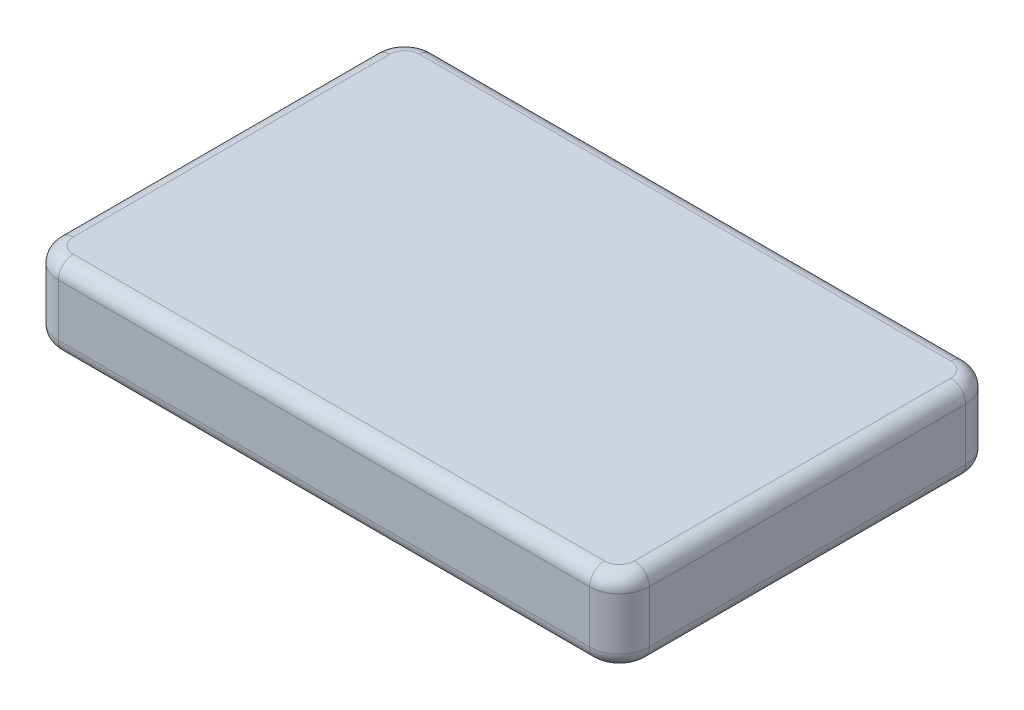
ISO-10303-21;
HEADER;
FILE_DESCRIPTION(('STEP AP214'),'2;1');
FILE_NAME('part.step','',(''),(''),'','','');
FILE_SCHEMA(('AUTOMOTIVE_DESIGN { 1 0 10303 214 1 1 1 1 }'));
ENDSEC;
DATA;
#1=APPLICATION_CONTEXT('core data for automotive mechanical design processes');
#2=APPLICATION_PROTOCOL_DEFINITION('international standard','automotive_design',2000,#1);
#3=PRODUCT_CONTEXT('',#1,'mechanical');
#4=PRODUCT('Part','Part','',(#3));
#5=PRODUCT_RELATED_PRODUCT_CATEGORY('part','',(#4));
#6=PRODUCT_DEFINITION_FORMATION('','',#4);
#7=PRODUCT_DEFINITION_CONTEXT('part definition',#1,'design');
#8=PRODUCT_DEFINITION('design','',#6,#7);
#9=PRODUCT_DEFINITION_SHAPE('','',#8);
#10=(LENGTH_UNIT() NAMED_UNIT(*) SI_UNIT(.MILLI.,.METRE.));
#11=(NAMED_UNIT(*) PLANE_ANGLE_UNIT() SI_UNIT($,.RADIAN.));
#12=(NAMED_UNIT(*) SI_UNIT($,.STERADIAN.) SOLID_ANGLE_UNIT());
#13=UNCERTAINTY_MEASURE_WITH_UNIT(LENGTH_MEASURE(1.E-05),#10,'distance_accuracy_value','');
#14=(GEOMETRIC_REPRESENTATION_CONTEXT(3) GLOBAL_UNCERTAINTY_ASSIGNED_CONTEXT((#13)) GLOBAL_UNIT_ASSIGNED_CONTEXT((#10,
#11,#12)) REPRESENTATION_CONTEXT('',''));
#15=CARTESIAN_POINT('',(0.,0.,0.));
#16=DIRECTION('',(0.,0.,1.));
#17=DIRECTION('',(1.,0.,0.));
#18=AXIS2_PLACEMENT_3D('',#15,#16,#17);
#19=CARTESIAN_POINT('',(-19.8,5.5,12.6));
#20=DIRECTION('',(1.,0.,0.));
#21=DIRECTION('',(0.,0.,-1.));
#22=AXIS2_PLACEMENT_3D('',#19,#20,#21);
#23=PLANE('',#22);
#24=DIRECTION('',(0.,-1.,0.));
#25=VECTOR('',#24,1.);
#26=CARTESIAN_POINT('',(-19.8,5.5,-10.6));
#27=LINE('',#26,#25);
#28=CARTESIAN_POINT('',(-19.8,4.5,-10.6));
#29=VERTEX_POINT('',#28);
#30=CARTESIAN_POINT('',(-19.8,1.,-10.6));
#31=VERTEX_POINT('',#30);
#32=EDGE_CURVE('E200',#29,#31,#27,.T.);
#33=ORIENTED_EDGE('',*,*,#32,.T.);
#34=DIRECTION('',(0.,0.,1.));
#35=VECTOR('',#34,1.);
#36=CARTESIAN_POINT('',(-19.8,1.,12.6));
#37=LINE('',#36,#35);
#38=CARTESIAN_POINT('',(-19.8,1.,10.6));
#39=VERTEX_POINT('',#38);
#40=EDGE_CURVE('E228',#31,#39,#37,.T.);
#41=ORIENTED_EDGE('',*,*,#40,.T.);
#42=DIRECTION('',(0.,-1.,0.));
#43=VECTOR('',#42,1.);
#44=CARTESIAN_POINT('',(-19.8,5.5,10.6));
#45=LINE('',#44,#43);
#46=CARTESIAN_POINT('',(-19.8,4.5,10.6));
#47=VERTEX_POINT('',#46);
#48=EDGE_CURVE('E194',#39,#47,#45,.F.);
#49=ORIENTED_EDGE('',*,*,#48,.T.);
#50=DIRECTION('',(0.,0.,1.));
#51=VECTOR('',#50,1.);
#52=CARTESIAN_POINT('',(-19.8,4.5,-10.6));
#53=LINE('',#52,#51);
#54=EDGE_CURVE('E225',#47,#29,#53,.F.);
#55=ORIENTED_EDGE('',*,*,#54,.T.);
#56=EDGE_LOOP('',(#33,#41,#49,#55));
#57=FACE_BOUND('',#56,.T.);
#58=ADVANCED_FACE('F38',(#57),#23,.F.);
#59=CARTESIAN_POINT('',(19.8,5.5,12.6));
#60=DIRECTION('',(0.,0.,-1.));
#61=DIRECTION('',(-1.,0.,0.));
#62=AXIS2_PLACEMENT_3D('',#59,#60,#61);
#63=PLANE('',#62);
#64=DIRECTION('',(0.,-1.,0.));
#65=VECTOR('',#64,1.);
#66=CARTESIAN_POINT('',(-17.8,5.5,12.6));
#67=LINE('',#66,#65);
#68=CARTESIAN_POINT('',(-17.8,4.5,12.6));
#69=VERTEX_POINT('',#68);
#70=CARTESIAN_POINT('',(-17.8,1.,12.6));
#71=VERTEX_POINT('',#70);
#72=EDGE_CURVE('E181',#69,#71,#67,.T.);
#73=ORIENTED_EDGE('',*,*,#72,.T.);
#74=DIRECTION('',(1.,0.,0.));
#75=VECTOR('',#74,1.);
#76=CARTESIAN_POINT('',(19.8,1.,12.6));
#77=LINE('',#76,#75);
#78=CARTESIAN_POINT('',(17.8,1.,12.6));
#79=VERTEX_POINT('',#78);
#80=EDGE_CURVE('E155',#71,#79,#77,.T.);
#81=ORIENTED_EDGE('',*,*,#80,.T.);
#82=DIRECTION('',(0.,-1.,0.));
#83=VECTOR('',#82,1.);
#84=CARTESIAN_POINT('',(17.8,5.5,12.6));
#85=LINE('',#84,#83);
#86=CARTESIAN_POINT('',(17.8,4.5,12.6));
#87=VERTEX_POINT('',#86);
#88=EDGE_CURVE('E178',#79,#87,#85,.F.);
#89=ORIENTED_EDGE('',*,*,#88,.T.);
#90=DIRECTION('',(1.,0.,0.));
#91=VECTOR('',#90,1.);
#92=CARTESIAN_POINT('',(-17.8,4.5,12.6));
#93=LINE('',#92,#91);
#94=EDGE_CURVE('E184',#87,#69,#93,.F.);
#95=ORIENTED_EDGE('',*,*,#94,.T.);
#96=EDGE_LOOP('',(#73,#81,#89,#95));
#97=FACE_BOUND('',#96,.T.);
#98=ADVANCED_FACE('F177',(#97),#63,.F.);
#99=CARTESIAN_POINT('',(19.8,5.5,12.6));
#100=DIRECTION('',(-1.,0.,0.));
#101=DIRECTION('',(0.,0.,1.));
#102=AXIS2_PLACEMENT_3D('',#99,#100,#101);
#103=PLANE('',#102);
#104=DIRECTION('',(0.,-1.,0.));
#105=VECTOR('',#104,1.);
#106=CARTESIAN_POINT('',(19.8,5.5,10.6));
#107=LINE('',#106,#105);
#108=CARTESIAN_POINT('',(19.8,4.5,10.6));
#109=VERTEX_POINT('',#108);
#110=CARTESIAN_POINT('',(19.8,1.,10.6));
#111=VERTEX_POINT('',#110);
#112=EDGE_CURVE('E189',#109,#111,#107,.T.);
#113=ORIENTED_EDGE('',*,*,#112,.T.);
#114=DIRECTION('',(0.,0.,-1.));
#115=VECTOR('',#114,1.);
#116=CARTESIAN_POINT('',(19.8,1.,12.6));
#117=LINE('',#116,#115);
#118=CARTESIAN_POINT('',(19.8,1.,-10.6));
#119=VERTEX_POINT('',#118);
#120=EDGE_CURVE('E223',#111,#119,#117,.T.);
#121=ORIENTED_EDGE('',*,*,#120,.T.);
#122=DIRECTION('',(0.,-1.,0.));
#123=VECTOR('',#122,1.);
#124=CARTESIAN_POINT('',(19.8,5.5,-10.6));
#125=LINE('',#124,#123);
#126=CARTESIAN_POINT('',(19.8,4.5,-10.6));
#127=VERTEX_POINT('',#126);
#128=EDGE_CURVE('E192',#119,#127,#125,.F.);
#129=ORIENTED_EDGE('',*,*,#128,.T.);
#130=DIRECTION('',(0.,0.,-1.));
#131=VECTOR('',#130,1.);
#132=CARTESIAN_POINT('',(19.8,4.5,10.6));
#133=LINE('',#132,#131);
#134=EDGE_CURVE('E171',#127,#109,#133,.F.);
#135=ORIENTED_EDGE('',*,*,#134,.T.);
#136=EDGE_LOOP('',(#113,#121,#129,#135));
#137=FACE_BOUND('',#136,.T.);
#138=ADVANCED_FACE('F304',(#137),#103,.F.);
#139=CARTESIAN_POINT('',(19.8,5.5,-12.6));
#140=DIRECTION('',(0.,0.,1.));
#141=DIRECTION('',(1.,0.,0.));
#142=AXIS2_PLACEMENT_3D('',#139,#140,#141);
#143=PLANE('',#142);
#144=DIRECTION('',(0.,-1.,0.));
#145=VECTOR('',#144,1.);
#146=CARTESIAN_POINT('',(17.8,5.5,-12.6));
#147=LINE('',#146,#145);
#148=CARTESIAN_POINT('',(17.8,4.5,-12.6));
#149=VERTEX_POINT('',#148);
#150=CARTESIAN_POINT('',(17.8,1.,-12.6));
#151=VERTEX_POINT('',#150);
#152=EDGE_CURVE('E188',#149,#151,#147,.T.);
#153=ORIENTED_EDGE('',*,*,#152,.T.);
#154=DIRECTION('',(-1.,0.,0.));
#155=VECTOR('',#154,1.);
#156=CARTESIAN_POINT('',(19.8,1.,-12.6));
#157=LINE('',#156,#155);
#158=CARTESIAN_POINT('',(-17.8,1.,-12.6));
#159=VERTEX_POINT('',#158);
#160=EDGE_CURVE('E232',#151,#159,#157,.T.);
#161=ORIENTED_EDGE('',*,*,#160,.T.);
#162=DIRECTION('',(0.,-1.,0.));
#163=VECTOR('',#162,1.);
#164=CARTESIAN_POINT('',(-17.8,5.5,-12.6));
#165=LINE('',#164,#163);
#166=CARTESIAN_POINT('',(-17.8,4.5,-12.6));
#167=VERTEX_POINT('',#166);
#168=EDGE_CURVE('E203',#159,#167,#165,.F.);
#169=ORIENTED_EDGE('',*,*,#168,.T.);
#170=DIRECTION('',(-1.,0.,0.));
#171=VECTOR('',#170,1.);
#172=CARTESIAN_POINT('',(17.8,4.5,-12.6));
#173=LINE('',#172,#171);
#174=EDGE_CURVE('E230',#167,#149,#173,.F.);
#175=ORIENTED_EDGE('',*,*,#174,.T.);
#176=EDGE_LOOP('',(#153,#161,#169,#175));
#177=FACE_BOUND('',#176,.T.);
#178=ADVANCED_FACE('F330',(#177),#143,.F.);
#179=CARTESIAN_POINT('',(0.,5.5,0.));
#180=DIRECTION('',(0.,1.,0.));
#181=DIRECTION('',(0.,0.,1.));
#182=AXIS2_PLACEMENT_3D('',#179,#180,#181);
#183=PLANE('',#182);
#184=DIRECTION('',(1.,0.,0.));
#185=VECTOR('',#184,1.);
#186=CARTESIAN_POINT('',(17.8,5.5,11.6));
#187=LINE('',#186,#185);
#188=CARTESIAN_POINT('',(-17.8,5.5,11.6));
#189=VERTEX_POINT('',#188);
#190=CARTESIAN_POINT('',(17.8,5.5,11.6));
#191=VERTEX_POINT('',#190);
#192=EDGE_CURVE('E55',#189,#191,#187,.T.);
#193=ORIENTED_EDGE('',*,*,#192,.T.);
#194=CARTESIAN_POINT('',(17.8,5.5,10.6));
#195=DIRECTION('',(0.,1.,0.));
#196=DIRECTION('',(0.,0.,1.));
#197=AXIS2_PLACEMENT_3D('',#194,#195,#196);
#198=CIRCLE('',#197,1.);
#199=CARTESIAN_POINT('',(18.8,5.5,10.6));
#200=VERTEX_POINT('',#199);
#201=EDGE_CURVE('E59',#191,#200,#198,.T.);
#202=ORIENTED_EDGE('',*,*,#201,.T.);
#203=DIRECTION('',(0.,0.,-1.));
#204=VECTOR('',#203,1.);
#205=CARTESIAN_POINT('',(18.8,5.5,-10.6));
#206=LINE('',#205,#204);
#207=CARTESIAN_POINT('',(18.8,5.5,-10.6));
#208=VERTEX_POINT('',#207);
#209=EDGE_CURVE('E245',#200,#208,#206,.T.);
#210=ORIENTED_EDGE('',*,*,#209,.T.);
#211=CARTESIAN_POINT('',(17.8,5.5,-10.6));
#212=DIRECTION('',(0.,1.,0.));
#213=DIRECTION('',(0.,0.,1.));
#214=AXIS2_PLACEMENT_3D('',#211,#212,#213);
#215=CIRCLE('',#214,1.);
#216=CARTESIAN_POINT('',(17.8,5.5,-11.6));
#217=VERTEX_POINT('',#216);
#218=EDGE_CURVE('E241',#208,#217,#215,.T.);
#219=ORIENTED_EDGE('',*,*,#218,.T.);
#220=DIRECTION('',(-1.,0.,0.));
#221=VECTOR('',#220,1.);
#222=CARTESIAN_POINT('',(-17.8,5.5,-11.6));
#223=LINE('',#222,#221);
#224=CARTESIAN_POINT('',(-17.8,5.5,-11.6));
#225=VERTEX_POINT('',#224);
#226=EDGE_CURVE('E236',#217,#225,#223,.T.);
#227=ORIENTED_EDGE('',*,*,#226,.T.);
#228=CARTESIAN_POINT('',(-17.8,5.5,-10.6));
#229=DIRECTION('',(0.,1.,0.));
#230=DIRECTION('',(0.,0.,1.));
#231=AXIS2_PLACEMENT_3D('',#228,#229,#230);
#232=CIRCLE('',#231,1.);
#233=CARTESIAN_POINT('',(-18.8,5.5,-10.6));
#234=VERTEX_POINT('',#233);
#235=EDGE_CURVE('E234',#225,#234,#232,.T.);
#236=ORIENTED_EDGE('',*,*,#235,.T.);
#237=DIRECTION('',(0.,0.,1.));
#238=VECTOR('',#237,1.);
#239=CARTESIAN_POINT('',(-18.8,5.5,10.6));
#240=LINE('',#239,#238);
#241=CARTESIAN_POINT('',(-18.8,5.5,10.6));
#242=VERTEX_POINT('',#241);
#243=EDGE_CURVE('E238',#234,#242,#240,.T.);
#244=ORIENTED_EDGE('',*,*,#243,.T.);
#245=CARTESIAN_POINT('',(-17.8,5.5,10.6));
#246=DIRECTION('',(0.,1.,0.));
#247=DIRECTION('',(0.,0.,1.));
#248=AXIS2_PLACEMENT_3D('',#245,#246,#247);
#249=CIRCLE('',#248,1.);
#250=EDGE_CURVE('E243',#242,#189,#249,.T.);
#251=ORIENTED_EDGE('',*,*,#250,.T.);
#252=EDGE_LOOP('',(#193,#202,#210,#219,#227,#236,#244,#251));
#253=FACE_BOUND('',#252,.T.);
#254=ADVANCED_FACE('F355',(#253),#183,.T.);
#255=CARTESIAN_POINT('',(0.,0.,0.));
#256=DIRECTION('',(0.,1.,0.));
#257=DIRECTION('',(0.,0.,1.));
#258=AXIS2_PLACEMENT_3D('',#255,#256,#257);
#259=PLANE('',#258);
#260=CARTESIAN_POINT('',(17.8,0.,10.6));
#261=DIRECTION('',(0.,1.,0.));
#262=DIRECTION('',(0.,0.,1.));
#263=AXIS2_PLACEMENT_3D('',#260,#261,#262);
#264=CIRCLE('',#263,1.);
#265=CARTESIAN_POINT('',(18.8,0.,10.6));
#266=VERTEX_POINT('',#265);
#267=CARTESIAN_POINT('',(17.8,0.,11.6));
#268=VERTEX_POINT('',#267);
#269=EDGE_CURVE('E218',#266,#268,#264,.F.);
#270=ORIENTED_EDGE('',*,*,#269,.T.);
#271=DIRECTION('',(1.,0.,0.));
#272=VECTOR('',#271,1.);
#273=CARTESIAN_POINT('',(0.,0.,11.6));
#274=LINE('',#273,#272);
#275=CARTESIAN_POINT('',(-17.8,0.,11.6));
#276=VERTEX_POINT('',#275);
#277=EDGE_CURVE('E157',#268,#276,#274,.F.);
#278=ORIENTED_EDGE('',*,*,#277,.T.);
#279=CARTESIAN_POINT('',(-17.8,0.,10.6));
#280=DIRECTION('',(0.,1.,0.));
#281=DIRECTION('',(0.,0.,1.));
#282=AXIS2_PLACEMENT_3D('',#279,#280,#281);
#283=CIRCLE('',#282,1.);
#284=CARTESIAN_POINT('',(-18.8,0.,10.6));
#285=VERTEX_POINT('',#284);
#286=EDGE_CURVE('E214',#276,#285,#283,.F.);
#287=ORIENTED_EDGE('',*,*,#286,.T.);
#288=DIRECTION('',(0.,0.,1.));
#289=VECTOR('',#288,1.);
#290=CARTESIAN_POINT('',(-18.8,0.,0.));
#291=LINE('',#290,#289);
#292=CARTESIAN_POINT('',(-18.8,0.,-10.6));
#293=VERTEX_POINT('',#292);
#294=EDGE_CURVE('E210',#285,#293,#291,.F.);
#295=ORIENTED_EDGE('',*,*,#294,.T.);
#296=CARTESIAN_POINT('',(-17.8,0.,-10.6));
#297=DIRECTION('',(0.,1.,0.));
#298=DIRECTION('',(0.,0.,1.));
#299=AXIS2_PLACEMENT_3D('',#296,#297,#298);
#300=CIRCLE('',#299,1.);
#301=CARTESIAN_POINT('',(-17.8,0.,-11.6));
#302=VERTEX_POINT('',#301);
#303=EDGE_CURVE('E183',#293,#302,#300,.F.);
#304=ORIENTED_EDGE('',*,*,#303,.T.);
#305=DIRECTION('',(-1.,0.,0.));
#306=VECTOR('',#305,1.);
#307=CARTESIAN_POINT('',(0.,0.,-11.6));
#308=LINE('',#307,#306);
#309=CARTESIAN_POINT('',(17.8,0.,-11.6));
#310=VERTEX_POINT('',#309);
#311=EDGE_CURVE('E208',#302,#310,#308,.F.);
#312=ORIENTED_EDGE('',*,*,#311,.T.);
#313=CARTESIAN_POINT('',(17.8,0.,-10.6));
#314=DIRECTION('',(0.,1.,0.));
#315=DIRECTION('',(0.,0.,1.));
#316=AXIS2_PLACEMENT_3D('',#313,#314,#315);
#317=CIRCLE('',#316,1.);
#318=CARTESIAN_POINT('',(18.8,0.,-10.6));
#319=VERTEX_POINT('',#318);
#320=EDGE_CURVE('E212',#310,#319,#317,.F.);
#321=ORIENTED_EDGE('',*,*,#320,.T.);
#322=DIRECTION('',(0.,0.,-1.));
#323=VECTOR('',#322,1.);
#324=CARTESIAN_POINT('',(18.8,0.,0.));
#325=LINE('',#324,#323);
#326=EDGE_CURVE('E216',#319,#266,#325,.F.);
#327=ORIENTED_EDGE('',*,*,#326,.T.);
#328=EDGE_LOOP('',(#270,#278,#287,#295,#304,#312,#321,#327));
#329=FACE_BOUND('',#328,.T.);
#330=ADVANCED_FACE('F320',(#329),#259,.F.);
#331=CARTESIAN_POINT('',(-17.8,5.5,10.6));
#332=DIRECTION('',(0.,-1.,0.));
#333=DIRECTION('',(0.,0.,-1.));
#334=AXIS2_PLACEMENT_3D('',#331,#332,#333);
#335=CYLINDRICAL_SURFACE('',#334,2.);
#336=ORIENTED_EDGE('',*,*,#48,.F.);
#337=CARTESIAN_POINT('',(-17.8,1.,10.6));
#338=DIRECTION('',(0.,1.,0.));
#339=DIRECTION('',(0.,0.,1.));
#340=AXIS2_PLACEMENT_3D('',#337,#338,#339);
#341=CIRCLE('',#340,2.);
#342=EDGE_CURVE('E251',#39,#71,#341,.T.);
#343=ORIENTED_EDGE('',*,*,#342,.T.);
#344=ORIENTED_EDGE('',*,*,#72,.F.);
#345=CARTESIAN_POINT('',(-17.8,4.5,10.6));
#346=DIRECTION('',(0.,1.,0.));
#347=DIRECTION('',(0.,0.,1.));
#348=AXIS2_PLACEMENT_3D('',#345,#346,#347);
#349=CIRCLE('',#348,2.);
#350=EDGE_CURVE('E249',#69,#47,#349,.F.);
#351=ORIENTED_EDGE('',*,*,#350,.T.);
#352=EDGE_LOOP('',(#336,#343,#344,#351));
#353=FACE_BOUND('',#352,.T.);
#354=ADVANCED_FACE('F378',(#353),#335,.T.);
#355=CARTESIAN_POINT('',(17.8,5.5,10.6));
#356=DIRECTION('',(0.,-1.,0.));
#357=DIRECTION('',(0.,0.,-1.));
#358=AXIS2_PLACEMENT_3D('',#355,#356,#357);
#359=CYLINDRICAL_SURFACE('',#358,2.);
#360=ORIENTED_EDGE('',*,*,#88,.F.);
#361=CARTESIAN_POINT('',(17.8,1.,10.6));
#362=DIRECTION('',(0.,1.,0.));
#363=DIRECTION('',(0.,0.,1.));
#364=AXIS2_PLACEMENT_3D('',#361,#362,#363);
#365=CIRCLE('',#364,2.);
#366=EDGE_CURVE('E163',#79,#111,#365,.T.);
#367=ORIENTED_EDGE('',*,*,#366,.T.);
#368=ORIENTED_EDGE('',*,*,#112,.F.);
#369=CARTESIAN_POINT('',(17.8,4.5,10.6));
#370=DIRECTION('',(0.,1.,0.));
#371=DIRECTION('',(0.,0.,1.));
#372=AXIS2_PLACEMENT_3D('',#369,#370,#371);
#373=CIRCLE('',#372,2.);
#374=EDGE_CURVE('E172',#109,#87,#373,.F.);
#375=ORIENTED_EDGE('',*,*,#374,.T.);
#376=EDGE_LOOP('',(#360,#367,#368,#375));
#377=FACE_BOUND('',#376,.T.);
#378=ADVANCED_FACE('F186',(#377),#359,.T.);
#379=CARTESIAN_POINT('',(17.8,5.5,-10.6));
#380=DIRECTION('',(0.,-1.,0.));
#381=DIRECTION('',(0.,0.,-1.));
#382=AXIS2_PLACEMENT_3D('',#379,#380,#381);
#383=CYLINDRICAL_SURFACE('',#382,2.);
#384=ORIENTED_EDGE('',*,*,#128,.F.);
#385=CARTESIAN_POINT('',(17.8,1.,-10.6));
#386=DIRECTION('',(0.,1.,0.));
#387=DIRECTION('',(0.,0.,1.));
#388=AXIS2_PLACEMENT_3D('',#385,#386,#387);
#389=CIRCLE('',#388,2.);
#390=EDGE_CURVE('E255',#119,#151,#389,.T.);
#391=ORIENTED_EDGE('',*,*,#390,.T.);
#392=ORIENTED_EDGE('',*,*,#152,.F.);
#393=CARTESIAN_POINT('',(17.8,4.5,-10.6));
#394=DIRECTION('',(0.,1.,0.));
#395=DIRECTION('',(0.,0.,1.));
#396=AXIS2_PLACEMENT_3D('',#393,#394,#395);
#397=CIRCLE('',#396,2.);
#398=EDGE_CURVE('E253',#149,#127,#397,.F.);
#399=ORIENTED_EDGE('',*,*,#398,.T.);
#400=EDGE_LOOP('',(#384,#391,#392,#399));
#401=FACE_BOUND('',#400,.T.);
#402=ADVANCED_FACE('F309',(#401),#383,.T.);
#403=CARTESIAN_POINT('',(-17.8,5.5,-10.6));
#404=DIRECTION('',(0.,-1.,0.));
#405=DIRECTION('',(0.,0.,-1.));
#406=AXIS2_PLACEMENT_3D('',#403,#404,#405);
#407=CYLINDRICAL_SURFACE('',#406,2.);
#408=ORIENTED_EDGE('',*,*,#168,.F.);
#409=CARTESIAN_POINT('',(-17.8,1.,-10.6));
#410=DIRECTION('',(0.,1.,0.));
#411=DIRECTION('',(0.,0.,1.));
#412=AXIS2_PLACEMENT_3D('',#409,#410,#411);
#413=CIRCLE('',#412,2.);
#414=EDGE_CURVE('E11',#159,#31,#413,.T.);
#415=ORIENTED_EDGE('',*,*,#414,.T.);
#416=ORIENTED_EDGE('',*,*,#32,.F.);
#417=CARTESIAN_POINT('',(-17.8,4.5,-10.6));
#418=DIRECTION('',(0.,1.,0.));
#419=DIRECTION('',(0.,0.,1.));
#420=AXIS2_PLACEMENT_3D('',#417,#418,#419);
#421=CIRCLE('',#420,2.);
#422=EDGE_CURVE('E47',#29,#167,#421,.F.);
#423=ORIENTED_EDGE('',*,*,#422,.T.);
#424=EDGE_LOOP('',(#408,#415,#416,#423));
#425=FACE_BOUND('',#424,.T.);
#426=ADVANCED_FACE('F333',(#425),#407,.T.);
#427=CARTESIAN_POINT('',(19.8,1.,-11.6));
#428=DIRECTION('',(-1.,0.,0.));
#429=DIRECTION('',(0.,0.,1.));
#430=AXIS2_PLACEMENT_3D('',#427,#428,#429);
#431=CYLINDRICAL_SURFACE('',#430,1.);
#432=CARTESIAN_POINT('',(17.8,1.,-11.6));
#433=DIRECTION('',(1.,0.,0.));
#434=DIRECTION('',(0.,0.,-1.));
#435=AXIS2_PLACEMENT_3D('',#432,#433,#434);
#436=CIRCLE('',#435,1.);
#437=EDGE_CURVE('E269',#310,#151,#436,.T.);
#438=ORIENTED_EDGE('',*,*,#437,.F.);
#439=ORIENTED_EDGE('',*,*,#311,.F.);
#440=CARTESIAN_POINT('',(-17.8,1.,-11.6));
#441=DIRECTION('',(-1.,0.,0.));
#442=DIRECTION('',(0.,0.,1.));
#443=AXIS2_PLACEMENT_3D('',#440,#441,#442);
#444=CIRCLE('',#443,1.);
#445=EDGE_CURVE('E272',#159,#302,#444,.T.);
#446=ORIENTED_EDGE('',*,*,#445,.F.);
#447=ORIENTED_EDGE('',*,*,#160,.F.);
#448=EDGE_LOOP('',(#438,#439,#446,#447));
#449=FACE_BOUND('',#448,.T.);
#450=ADVANCED_FACE('F326',(#449),#431,.T.);
#451=CARTESIAN_POINT('',(-17.8,1.,-10.6));
#452=DIRECTION('',(0.,1.,0.));
#453=DIRECTION('',(0.,0.,1.));
#454=AXIS2_PLACEMENT_3D('',#451,#452,#453);
#455=DEGENERATE_TOROIDAL_SURFACE('',#454,1.,1.,.T.);
#456=ORIENTED_EDGE('',*,*,#445,.T.);
#457=ORIENTED_EDGE('',*,*,#303,.F.);
#458=CARTESIAN_POINT('',(-18.8,1.,-10.6));
#459=DIRECTION('',(0.,0.,1.));
#460=DIRECTION('',(1.,0.,0.));
#461=AXIS2_PLACEMENT_3D('',#458,#459,#460);
#462=CIRCLE('',#461,1.);
#463=EDGE_CURVE('E266',#31,#293,#462,.T.);
#464=ORIENTED_EDGE('',*,*,#463,.F.);
#465=ORIENTED_EDGE('',*,*,#414,.F.);
#466=EDGE_LOOP('',(#456,#457,#464,#465));
#467=FACE_BOUND('',#466,.T.);
#468=ADVANCED_FACE('F404',(#467),#455,.T.);
#469=CARTESIAN_POINT('',(17.8,1.,-10.6));
#470=DIRECTION('',(0.,1.,0.));
#471=DIRECTION('',(0.,0.,1.));
#472=AXIS2_PLACEMENT_3D('',#469,#470,#471);
#473=DEGENERATE_TOROIDAL_SURFACE('',#472,1.,1.,.T.);
#474=ORIENTED_EDGE('',*,*,#437,.T.);
#475=ORIENTED_EDGE('',*,*,#390,.F.);
#476=CARTESIAN_POINT('',(18.8,1.,-10.6));
#477=DIRECTION('',(0.,0.,1.));
#478=DIRECTION('',(1.,0.,0.));
#479=AXIS2_PLACEMENT_3D('',#476,#477,#478);
#480=CIRCLE('',#479,1.);
#481=EDGE_CURVE('E263',#319,#119,#480,.T.);
#482=ORIENTED_EDGE('',*,*,#481,.F.);
#483=ORIENTED_EDGE('',*,*,#320,.F.);
#484=EDGE_LOOP('',(#474,#475,#482,#483));
#485=FACE_BOUND('',#484,.T.);
#486=ADVANCED_FACE('F313',(#485),#473,.T.);
#487=CARTESIAN_POINT('',(-18.8,1.,12.6));
#488=DIRECTION('',(0.,0.,1.));
#489=DIRECTION('',(1.,0.,0.));
#490=AXIS2_PLACEMENT_3D('',#487,#488,#489);
#491=CYLINDRICAL_SURFACE('',#490,1.);
#492=ORIENTED_EDGE('',*,*,#463,.T.);
#493=ORIENTED_EDGE('',*,*,#294,.F.);
#494=CARTESIAN_POINT('',(-18.8,1.,10.6));
#495=DIRECTION('',(0.,0.,1.));
#496=DIRECTION('',(1.,0.,0.));
#497=AXIS2_PLACEMENT_3D('',#494,#495,#496);
#498=CIRCLE('',#497,1.);
#499=EDGE_CURVE('E260',#39,#285,#498,.T.);
#500=ORIENTED_EDGE('',*,*,#499,.F.);
#501=ORIENTED_EDGE('',*,*,#40,.F.);
#502=EDGE_LOOP('',(#492,#493,#500,#501));
#503=FACE_BOUND('',#502,.T.);
#504=ADVANCED_FACE('F398',(#503),#491,.T.);
#505=CARTESIAN_POINT('',(18.8,1.,12.6));
#506=DIRECTION('',(0.,0.,-1.));
#507=DIRECTION('',(-1.,0.,0.));
#508=AXIS2_PLACEMENT_3D('',#505,#506,#507);
#509=CYLINDRICAL_SURFACE('',#508,1.);
#510=ORIENTED_EDGE('',*,*,#481,.T.);
#511=ORIENTED_EDGE('',*,*,#120,.F.);
#512=CARTESIAN_POINT('',(18.8,1.,10.6));
#513=DIRECTION('',(0.,0.,1.));
#514=DIRECTION('',(1.,0.,0.));
#515=AXIS2_PLACEMENT_3D('',#512,#513,#514);
#516=CIRCLE('',#515,1.);
#517=EDGE_CURVE('E166',#266,#111,#516,.T.);
#518=ORIENTED_EDGE('',*,*,#517,.F.);
#519=ORIENTED_EDGE('',*,*,#326,.F.);
#520=EDGE_LOOP('',(#510,#511,#518,#519));
#521=FACE_BOUND('',#520,.T.);
#522=ADVANCED_FACE('F318',(#521),#509,.T.);
#523=CARTESIAN_POINT('',(-17.8,1.,10.6));
#524=DIRECTION('',(0.,1.,0.));
#525=DIRECTION('',(0.,0.,1.));
#526=AXIS2_PLACEMENT_3D('',#523,#524,#525);
#527=DEGENERATE_TOROIDAL_SURFACE('',#526,1.,1.,.T.);
#528=ORIENTED_EDGE('',*,*,#499,.T.);
#529=ORIENTED_EDGE('',*,*,#286,.F.);
#530=CARTESIAN_POINT('',(-17.8,1.,11.6));
#531=DIRECTION('',(1.,0.,0.));
#532=DIRECTION('',(0.,0.,-1.));
#533=AXIS2_PLACEMENT_3D('',#530,#531,#532);
#534=CIRCLE('',#533,1.);
#535=EDGE_CURVE('E160',#71,#276,#534,.T.);
#536=ORIENTED_EDGE('',*,*,#535,.F.);
#537=ORIENTED_EDGE('',*,*,#342,.F.);
#538=EDGE_LOOP('',(#528,#529,#536,#537));
#539=FACE_BOUND('',#538,.T.);
#540=ADVANCED_FACE('F392',(#539),#527,.T.);
#541=CARTESIAN_POINT('',(17.8,1.,10.6));
#542=DIRECTION('',(0.,1.,0.));
#543=DIRECTION('',(0.,0.,1.));
#544=AXIS2_PLACEMENT_3D('',#541,#542,#543);
#545=DEGENERATE_TOROIDAL_SURFACE('',#544,1.,1.,.T.);
#546=ORIENTED_EDGE('',*,*,#517,.T.);
#547=ORIENTED_EDGE('',*,*,#366,.F.);
#548=CARTESIAN_POINT('',(17.8,1.,11.6));
#549=DIRECTION('',(-1.,0.,0.));
#550=DIRECTION('',(0.,0.,1.));
#551=AXIS2_PLACEMENT_3D('',#548,#549,#550);
#552=CIRCLE('',#551,1.);
#553=EDGE_CURVE('E151',#268,#79,#552,.T.);
#554=ORIENTED_EDGE('',*,*,#553,.F.);
#555=ORIENTED_EDGE('',*,*,#269,.F.);
#556=EDGE_LOOP('',(#546,#547,#554,#555));
#557=FACE_BOUND('',#556,.T.);
#558=ADVANCED_FACE('F164',(#557),#545,.T.);
#559=CARTESIAN_POINT('',(19.8,1.,11.6));
#560=DIRECTION('',(1.,0.,0.));
#561=DIRECTION('',(0.,0.,-1.));
#562=AXIS2_PLACEMENT_3D('',#559,#560,#561);
#563=CYLINDRICAL_SURFACE('',#562,1.);
#564=ORIENTED_EDGE('',*,*,#535,.T.);
#565=ORIENTED_EDGE('',*,*,#277,.F.);
#566=ORIENTED_EDGE('',*,*,#553,.T.);
#567=ORIENTED_EDGE('',*,*,#80,.F.);
#568=EDGE_LOOP('',(#564,#565,#566,#567));
#569=FACE_BOUND('',#568,.T.);
#570=ADVANCED_FACE('F153',(#569),#563,.T.);
#571=CARTESIAN_POINT('',(18.8,4.5,0.));
#572=DIRECTION('',(0.,0.,1.));
#573=DIRECTION('',(1.,0.,0.));
#574=AXIS2_PLACEMENT_3D('',#571,#572,#573);
#575=CYLINDRICAL_SURFACE('',#574,1.);
#576=CARTESIAN_POINT('',(18.8,4.5,10.6));
#577=DIRECTION('',(0.,0.,1.));
#578=DIRECTION('',(1.,0.,0.));
#579=AXIS2_PLACEMENT_3D('',#576,#577,#578);
#580=CIRCLE('',#579,1.);
#581=EDGE_CURVE('E290',#109,#200,#580,.T.);
#582=ORIENTED_EDGE('',*,*,#581,.F.);
#583=ORIENTED_EDGE('',*,*,#134,.F.);
#584=CARTESIAN_POINT('',(18.8,4.5,-10.6));
#585=DIRECTION('',(0.,0.,-1.));
#586=DIRECTION('',(-1.,0.,0.));
#587=AXIS2_PLACEMENT_3D('',#584,#585,#586);
#588=CIRCLE('',#587,1.);
#589=EDGE_CURVE('E42',#208,#127,#588,.T.);
#590=ORIENTED_EDGE('',*,*,#589,.F.);
#591=ORIENTED_EDGE('',*,*,#209,.F.);
#592=EDGE_LOOP('',(#582,#583,#590,#591));
#593=FACE_BOUND('',#592,.T.);
#594=ADVANCED_FACE('F40',(#593),#575,.T.);
#595=CARTESIAN_POINT('',(17.8,4.5,-10.6));
#596=DIRECTION('',(0.,1.,0.));
#597=DIRECTION('',(0.,0.,1.));
#598=AXIS2_PLACEMENT_3D('',#595,#596,#597);
#599=DEGENERATE_TOROIDAL_SURFACE('',#598,1.,1.,.T.);
#600=ORIENTED_EDGE('',*,*,#589,.T.);
#601=ORIENTED_EDGE('',*,*,#398,.F.);
#602=CARTESIAN_POINT('',(17.8,4.5,-11.6));
#603=DIRECTION('',(-1.,0.,0.));
#604=DIRECTION('',(0.,0.,1.));
#605=AXIS2_PLACEMENT_3D('',#602,#603,#604);
#606=CIRCLE('',#605,1.);
#607=EDGE_CURVE('E288',#217,#149,#606,.T.);
#608=ORIENTED_EDGE('',*,*,#607,.F.);
#609=ORIENTED_EDGE('',*,*,#218,.F.);
#610=EDGE_LOOP('',(#600,#601,#608,#609));
#611=FACE_BOUND('',#610,.T.);
#612=ADVANCED_FACE('F299',(#611),#599,.T.);
#613=CARTESIAN_POINT('',(17.8,4.5,10.6));
#614=DIRECTION('',(0.,1.,0.));
#615=DIRECTION('',(0.,0.,1.));
#616=AXIS2_PLACEMENT_3D('',#613,#614,#615);
#617=DEGENERATE_TOROIDAL_SURFACE('',#616,1.,1.,.T.);
#618=ORIENTED_EDGE('',*,*,#581,.T.);
#619=ORIENTED_EDGE('',*,*,#201,.F.);
#620=CARTESIAN_POINT('',(17.8,4.5,11.6));
#621=DIRECTION('',(-1.,0.,0.));
#622=DIRECTION('',(0.,0.,1.));
#623=AXIS2_PLACEMENT_3D('',#620,#621,#622);
#624=CIRCLE('',#623,1.);
#625=EDGE_CURVE('E285',#87,#191,#624,.T.);
#626=ORIENTED_EDGE('',*,*,#625,.F.);
#627=ORIENTED_EDGE('',*,*,#374,.F.);
#628=EDGE_LOOP('',(#618,#619,#626,#627));
#629=FACE_BOUND('',#628,.T.);
#630=ADVANCED_FACE('F361',(#629),#617,.T.);
#631=CARTESIAN_POINT('',(0.,4.5,-11.6));
#632=DIRECTION('',(1.,0.,0.));
#633=DIRECTION('',(0.,0.,-1.));
#634=AXIS2_PLACEMENT_3D('',#631,#632,#633);
#635=CYLINDRICAL_SURFACE('',#634,1.);
#636=ORIENTED_EDGE('',*,*,#607,.T.);
#637=ORIENTED_EDGE('',*,*,#174,.F.);
#638=CARTESIAN_POINT('',(-17.8,4.5,-11.6));
#639=DIRECTION('',(-1.,0.,0.));
#640=DIRECTION('',(0.,0.,1.));
#641=AXIS2_PLACEMENT_3D('',#638,#639,#640);
#642=CIRCLE('',#641,1.);
#643=EDGE_CURVE('E282',#225,#167,#642,.T.);
#644=ORIENTED_EDGE('',*,*,#643,.F.);
#645=ORIENTED_EDGE('',*,*,#226,.F.);
#646=EDGE_LOOP('',(#636,#637,#644,#645));
#647=FACE_BOUND('',#646,.T.);
#648=ADVANCED_FACE('F358',(#647),#635,.T.);
#649=CARTESIAN_POINT('',(0.,4.5,11.6));
#650=DIRECTION('',(-1.,0.,0.));
#651=DIRECTION('',(0.,0.,1.));
#652=AXIS2_PLACEMENT_3D('',#649,#650,#651);
#653=CYLINDRICAL_SURFACE('',#652,1.);
#654=ORIENTED_EDGE('',*,*,#625,.T.);
#655=ORIENTED_EDGE('',*,*,#192,.F.);
#656=CARTESIAN_POINT('',(-17.8,4.5,11.6));
#657=DIRECTION('',(-1.,0.,0.));
#658=DIRECTION('',(0.,0.,1.));
#659=AXIS2_PLACEMENT_3D('',#656,#657,#658);
#660=CIRCLE('',#659,1.);
#661=EDGE_CURVE('E279',#69,#189,#660,.T.);
#662=ORIENTED_EDGE('',*,*,#661,.F.);
#663=ORIENTED_EDGE('',*,*,#94,.F.);
#664=EDGE_LOOP('',(#654,#655,#662,#663));
#665=FACE_BOUND('',#664,.T.);
#666=ADVANCED_FACE('F360',(#665),#653,.T.);
#667=CARTESIAN_POINT('',(-17.8,4.5,-10.6));
#668=DIRECTION('',(0.,1.,0.));
#669=DIRECTION('',(0.,0.,1.));
#670=AXIS2_PLACEMENT_3D('',#667,#668,#669);
#671=DEGENERATE_TOROIDAL_SURFACE('',#670,1.,1.,.T.);
#672=ORIENTED_EDGE('',*,*,#643,.T.);
#673=ORIENTED_EDGE('',*,*,#422,.F.);
#674=CARTESIAN_POINT('',(-18.8,4.5,-10.6));
#675=DIRECTION('',(0.,0.,1.));
#676=DIRECTION('',(1.,0.,0.));
#677=AXIS2_PLACEMENT_3D('',#674,#675,#676);
#678=CIRCLE('',#677,1.);
#679=EDGE_CURVE('E277',#234,#29,#678,.T.);
#680=ORIENTED_EDGE('',*,*,#679,.F.);
#681=ORIENTED_EDGE('',*,*,#235,.F.);
#682=EDGE_LOOP('',(#672,#673,#680,#681));
#683=FACE_BOUND('',#682,.T.);
#684=ADVANCED_FACE('F338',(#683),#671,.T.);
#685=CARTESIAN_POINT('',(-17.8,4.5,10.6));
#686=DIRECTION('',(0.,1.,0.));
#687=DIRECTION('',(0.,0.,1.));
#688=AXIS2_PLACEMENT_3D('',#685,#686,#687);
#689=DEGENERATE_TOROIDAL_SURFACE('',#688,1.,1.,.T.);
#690=ORIENTED_EDGE('',*,*,#661,.T.);
#691=ORIENTED_EDGE('',*,*,#250,.F.);
#692=CARTESIAN_POINT('',(-18.8,4.5,10.6));
#693=DIRECTION('',(0.,0.,-1.));
#694=DIRECTION('',(-1.,0.,0.));
#695=AXIS2_PLACEMENT_3D('',#692,#693,#694);
#696=CIRCLE('',#695,1.);
#697=EDGE_CURVE('E275',#47,#242,#696,.T.);
#698=ORIENTED_EDGE('',*,*,#697,.F.);
#699=ORIENTED_EDGE('',*,*,#350,.F.);
#700=EDGE_LOOP('',(#690,#691,#698,#699));
#701=FACE_BOUND('',#700,.T.);
#702=ADVANCED_FACE('F353',(#701),#689,.T.);
#703=CARTESIAN_POINT('',(-18.8,4.5,0.));
#704=DIRECTION('',(0.,0.,-1.));
#705=DIRECTION('',(-1.,0.,0.));
#706=AXIS2_PLACEMENT_3D('',#703,#704,#705);
#707=CYLINDRICAL_SURFACE('',#706,1.);
#708=ORIENTED_EDGE('',*,*,#679,.T.);
#709=ORIENTED_EDGE('',*,*,#54,.F.);
#710=ORIENTED_EDGE('',*,*,#697,.T.);
#711=ORIENTED_EDGE('',*,*,#243,.F.);
#712=EDGE_LOOP('',(#708,#709,#710,#711));
#713=FACE_BOUND('',#712,.T.);
#714=ADVANCED_FACE('F349',(#713),#707,.T.);
#715=CLOSED_SHELL('',(#58,#98,#138,#178,#254,#330,#354,#378,#402,#426,#450,#468,#486,#504,#522,
#540,#558,#570,#594,#612,#630,#648,#666,#684,#702,#714));
#716=MANIFOLD_SOLID_BREP('B2',#715);
#717=ADVANCED_BREP_SHAPE_REPRESENTATION('',(#18,#716),#14);
#718=SHAPE_DEFINITION_REPRESENTATION(#9,#717);
ENDSEC;
END-ISO-10303-21;
